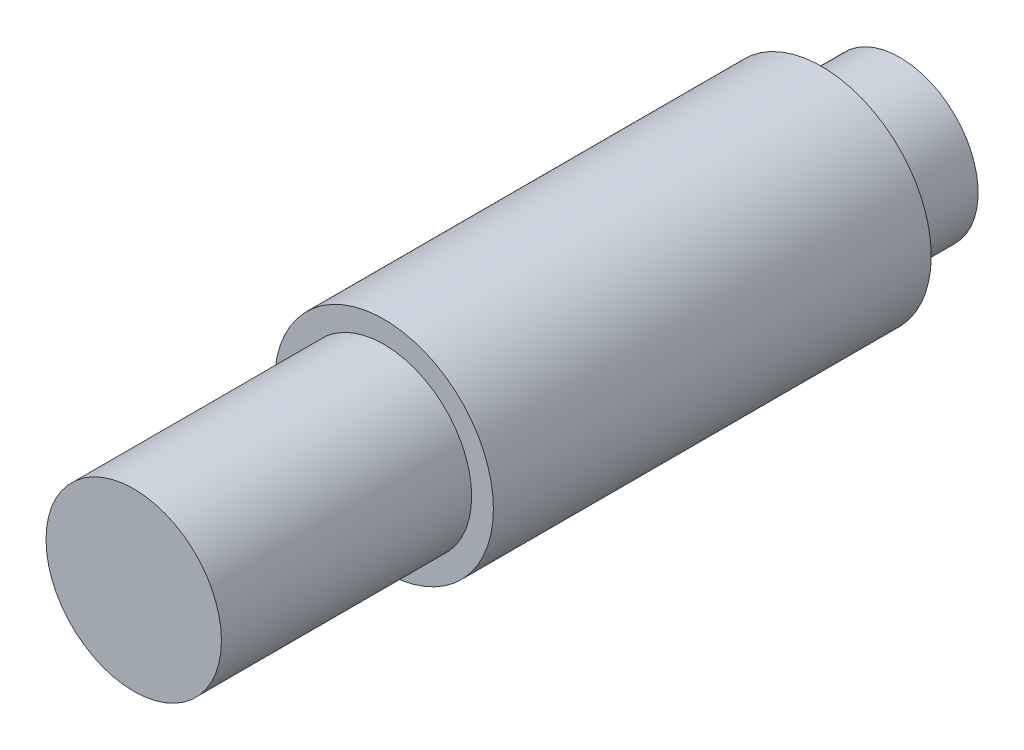
ISO-10303-21;
HEADER;
FILE_DESCRIPTION(('STEP AP214'),'2;1');
FILE_NAME('part.step','',(''),(''),'','','');
FILE_SCHEMA(('AUTOMOTIVE_DESIGN { 1 0 10303 214 1 1 1 1 }'));
ENDSEC;
DATA;
#1=APPLICATION_CONTEXT('core data for automotive mechanical design processes');
#2=APPLICATION_PROTOCOL_DEFINITION('international standard','automotive_design',2000,#1);
#3=PRODUCT_CONTEXT('',#1,'mechanical');
#4=PRODUCT('Part','Part','',(#3));
#5=PRODUCT_RELATED_PRODUCT_CATEGORY('part','',(#4));
#6=PRODUCT_DEFINITION_FORMATION('','',#4);
#7=PRODUCT_DEFINITION_CONTEXT('part definition',#1,'design');
#8=PRODUCT_DEFINITION('design','',#6,#7);
#9=PRODUCT_DEFINITION_SHAPE('','',#8);
#10=(LENGTH_UNIT() NAMED_UNIT(*) SI_UNIT(.MILLI.,.METRE.));
#11=(NAMED_UNIT(*) PLANE_ANGLE_UNIT() SI_UNIT($,.RADIAN.));
#12=(NAMED_UNIT(*) SI_UNIT($,.STERADIAN.) SOLID_ANGLE_UNIT());
#13=UNCERTAINTY_MEASURE_WITH_UNIT(LENGTH_MEASURE(1.E-05),#10,'distance_accuracy_value','');
#14=(GEOMETRIC_REPRESENTATION_CONTEXT(3) GLOBAL_UNCERTAINTY_ASSIGNED_CONTEXT((#13)) GLOBAL_UNIT_ASSIGNED_CONTEXT((#10,
#11,#12)) REPRESENTATION_CONTEXT('',''));
#15=CARTESIAN_POINT('',(0.,0.,0.));
#16=DIRECTION('',(0.,0.,1.));
#17=DIRECTION('',(1.,0.,0.));
#18=AXIS2_PLACEMENT_3D('',#15,#16,#17);
#19=CARTESIAN_POINT('',(0.,0.,70.));
#20=DIRECTION('',(0.,0.,-1.));
#21=DIRECTION('',(-1.,0.,0.));
#22=AXIS2_PLACEMENT_3D('',#19,#20,#21);
#23=CYLINDRICAL_SURFACE('',#22,17.5);
#24=CARTESIAN_POINT('',(0.,0.,70.));
#25=DIRECTION('',(0.,0.,1.));
#26=DIRECTION('',(1.,0.,0.));
#27=AXIS2_PLACEMENT_3D('',#24,#25,#26);
#28=CIRCLE('',#27,17.5);
#29=CARTESIAN_POINT('',(17.5,0.,70.));
#30=VERTEX_POINT('',#29);
#31=EDGE_CURVE('E46',#30,#30,#28,.T.);
#32=ORIENTED_EDGE('',*,*,#31,.F.);
#33=EDGE_LOOP('',(#32));
#34=FACE_BOUND('',#33,.T.);
#35=CARTESIAN_POINT('',(0.,0.,0.));
#36=DIRECTION('',(0.,0.,1.));
#37=DIRECTION('',(1.,0.,0.));
#38=AXIS2_PLACEMENT_3D('',#35,#36,#37);
#39=CIRCLE('',#38,17.5);
#40=CARTESIAN_POINT('',(17.5,0.,0.));
#41=VERTEX_POINT('',#40);
#42=EDGE_CURVE('E37',#41,#41,#39,.T.);
#43=ORIENTED_EDGE('',*,*,#42,.T.);
#44=EDGE_LOOP('',(#43));
#45=FACE_BOUND('',#44,.T.);
#46=ADVANCED_FACE('F34',(#34,#45),#23,.T.);
#47=CARTESIAN_POINT('',(0.,0.,70.));
#48=DIRECTION('',(0.,0.,1.));
#49=DIRECTION('',(1.,0.,0.));
#50=AXIS2_PLACEMENT_3D('',#47,#48,#49);
#51=PLANE('',#50);
#52=CARTESIAN_POINT('',(0.,0.,70.));
#53=DIRECTION('',(0.,0.,1.));
#54=DIRECTION('',(1.,0.,0.));
#55=AXIS2_PLACEMENT_3D('',#52,#53,#54);
#56=CIRCLE('',#55,14.0250000000004);
#57=CARTESIAN_POINT('',(14.0250000000004,0.,70.));
#58=VERTEX_POINT('',#57);
#59=EDGE_CURVE('E41',#58,#58,#56,.T.);
#60=ORIENTED_EDGE('',*,*,#59,.F.);
#61=EDGE_LOOP('',(#60));
#62=FACE_BOUND('',#61,.T.);
#63=ORIENTED_EDGE('',*,*,#31,.T.);
#64=EDGE_LOOP('',(#63));
#65=FACE_BOUND('',#64,.T.);
#66=ADVANCED_FACE('F63',(#62,#65),#51,.T.);
#67=CARTESIAN_POINT('',(0.,0.,0.));
#68=DIRECTION('',(0.,0.,1.));
#69=DIRECTION('',(1.,0.,0.));
#70=AXIS2_PLACEMENT_3D('',#67,#68,#69);
#71=PLANE('',#70);
#72=CARTESIAN_POINT('',(0.,0.,0.));
#73=DIRECTION('',(0.,0.,-1.));
#74=DIRECTION('',(-1.,0.,0.));
#75=AXIS2_PLACEMENT_3D('',#72,#73,#74);
#76=CIRCLE('',#75,12.5);
#77=CARTESIAN_POINT('',(-12.5,0.,0.));
#78=VERTEX_POINT('',#77);
#79=EDGE_CURVE('E10',#78,#78,#76,.T.);
#80=ORIENTED_EDGE('',*,*,#79,.F.);
#81=EDGE_LOOP('',(#80));
#82=FACE_BOUND('',#81,.T.);
#83=ORIENTED_EDGE('',*,*,#42,.F.);
#84=EDGE_LOOP('',(#83));
#85=FACE_BOUND('',#84,.T.);
#86=ADVANCED_FACE('F60',(#82,#85),#71,.F.);
#87=CARTESIAN_POINT('',(0.,0.,110.));
#88=DIRECTION('',(0.,0.,-1.));
#89=DIRECTION('',(-1.,0.,0.));
#90=AXIS2_PLACEMENT_3D('',#87,#88,#89);
#91=CYLINDRICAL_SURFACE('',#90,14.0250000000004);
#92=CARTESIAN_POINT('',(0.,0.,110.));
#93=DIRECTION('',(0.,0.,1.));
#94=DIRECTION('',(1.,0.,0.));
#95=AXIS2_PLACEMENT_3D('',#92,#93,#94);
#96=CIRCLE('',#95,14.0250000000004);
#97=CARTESIAN_POINT('',(14.0250000000004,0.,110.));
#98=VERTEX_POINT('',#97);
#99=EDGE_CURVE('E51',#98,#98,#96,.T.);
#100=ORIENTED_EDGE('',*,*,#99,.F.);
#101=EDGE_LOOP('',(#100));
#102=FACE_BOUND('',#101,.T.);
#103=ORIENTED_EDGE('',*,*,#59,.T.);
#104=EDGE_LOOP('',(#103));
#105=FACE_BOUND('',#104,.T.);
#106=ADVANCED_FACE('F62',(#102,#105),#91,.T.);
#107=CARTESIAN_POINT('',(0.,0.,110.));
#108=DIRECTION('',(0.,0.,1.));
#109=DIRECTION('',(1.,0.,0.));
#110=AXIS2_PLACEMENT_3D('',#107,#108,#109);
#111=PLANE('',#110);
#112=ORIENTED_EDGE('',*,*,#99,.T.);
#113=EDGE_LOOP('',(#112));
#114=FACE_BOUND('',#113,.T.);
#115=ADVANCED_FACE('F69',(#114),#111,.T.);
#116=CARTESIAN_POINT('',(0.,0.,-12.5));
#117=DIRECTION('',(0.,0.,1.));
#118=DIRECTION('',(1.,0.,0.));
#119=AXIS2_PLACEMENT_3D('',#116,#117,#118);
#120=CYLINDRICAL_SURFACE('',#119,12.5);
#121=CARTESIAN_POINT('',(0.,0.,-12.5));
#122=DIRECTION('',(0.,0.,-1.));
#123=DIRECTION('',(-1.,0.,0.));
#124=AXIS2_PLACEMENT_3D('',#121,#122,#123);
#125=CIRCLE('',#124,12.5);
#126=CARTESIAN_POINT('',(-12.5,0.,-12.5));
#127=VERTEX_POINT('',#126);
#128=EDGE_CURVE('E50',#127,#127,#125,.T.);
#129=ORIENTED_EDGE('',*,*,#128,.F.);
#130=EDGE_LOOP('',(#129));
#131=FACE_BOUND('',#130,.T.);
#132=ORIENTED_EDGE('',*,*,#79,.T.);
#133=EDGE_LOOP('',(#132));
#134=FACE_BOUND('',#133,.T.);
#135=ADVANCED_FACE('F99',(#131,#134),#120,.T.);
#136=CARTESIAN_POINT('',(0.,0.,-12.5));
#137=DIRECTION('',(0.,0.,-1.));
#138=DIRECTION('',(-1.,0.,0.));
#139=AXIS2_PLACEMENT_3D('',#136,#137,#138);
#140=PLANE('',#139);
#141=ORIENTED_EDGE('',*,*,#128,.T.);
#142=EDGE_LOOP('',(#141));
#143=FACE_BOUND('',#142,.T.);
#144=ADVANCED_FACE('F115',(#143),#140,.T.);
#145=CLOSED_SHELL('',(#46,#66,#86,#106,#115,#135,#144));
#146=MANIFOLD_SOLID_BREP('B2',#145);
#147=ADVANCED_BREP_SHAPE_REPRESENTATION('',(#18,#146),#14);
#148=SHAPE_DEFINITION_REPRESENTATION(#9,#147);
ENDSEC;
END-ISO-10303-21;
